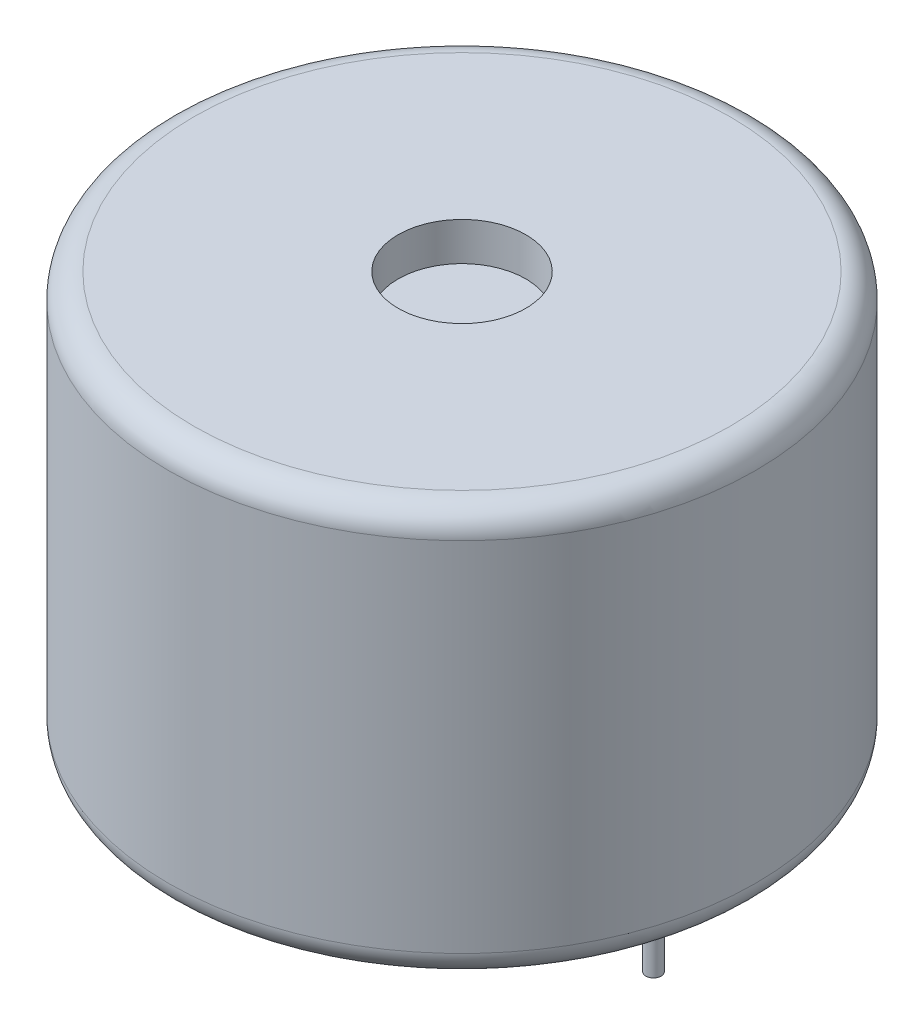
ISO-10303-21;
HEADER;
FILE_DESCRIPTION(('STEP AP214'),'2;1');
FILE_NAME('part.step','',(''),(''),'','','');
FILE_SCHEMA(('AUTOMOTIVE_DESIGN { 1 0 10303 214 1 1 1 1 }'));
ENDSEC;
DATA;
#1=APPLICATION_CONTEXT('core data for automotive mechanical design processes');
#2=APPLICATION_PROTOCOL_DEFINITION('international standard','automotive_design',2000,#1);
#3=PRODUCT_CONTEXT('',#1,'mechanical');
#4=PRODUCT('Part','Part','',(#3));
#5=PRODUCT_RELATED_PRODUCT_CATEGORY('part','',(#4));
#6=PRODUCT_DEFINITION_FORMATION('','',#4);
#7=PRODUCT_DEFINITION_CONTEXT('part definition',#1,'design');
#8=PRODUCT_DEFINITION('design','',#6,#7);
#9=PRODUCT_DEFINITION_SHAPE('','',#8);
#10=(LENGTH_UNIT() NAMED_UNIT(*) SI_UNIT(.MILLI.,.METRE.));
#11=(NAMED_UNIT(*) PLANE_ANGLE_UNIT() SI_UNIT($,.RADIAN.));
#12=(NAMED_UNIT(*) SI_UNIT($,.STERADIAN.) SOLID_ANGLE_UNIT());
#13=UNCERTAINTY_MEASURE_WITH_UNIT(LENGTH_MEASURE(1.E-05),#10,'distance_accuracy_value','');
#14=(GEOMETRIC_REPRESENTATION_CONTEXT(3) GLOBAL_UNCERTAINTY_ASSIGNED_CONTEXT((#13)) GLOBAL_UNIT_ASSIGNED_CONTEXT((#10,
#11,#12)) REPRESENTATION_CONTEXT('',''));
#15=CARTESIAN_POINT('',(0.,0.,0.));
#16=DIRECTION('',(0.,0.,1.));
#17=DIRECTION('',(1.,0.,0.));
#18=AXIS2_PLACEMENT_3D('',#15,#16,#17);
#19=CARTESIAN_POINT('',(0.,16.,0.));
#20=DIRECTION('',(0.,-1.,0.));
#21=DIRECTION('',(0.,0.,-1.));
#22=AXIS2_PLACEMENT_3D('',#19,#20,#21);
#23=CYLINDRICAL_SURFACE('',#22,11.5);
#24=CARTESIAN_POINT('',(0.,1.,0.));
#25=DIRECTION('',(0.,1.,0.));
#26=DIRECTION('',(0.,0.,1.));
#27=AXIS2_PLACEMENT_3D('',#24,#25,#26);
#28=CIRCLE('',#27,11.5);
#29=CARTESIAN_POINT('',(0.,1.,11.5));
#30=VERTEX_POINT('',#29);
#31=EDGE_CURVE('E48',#30,#30,#28,.T.);
#32=ORIENTED_EDGE('',*,*,#31,.T.);
#33=EDGE_LOOP('',(#32));
#34=FACE_BOUND('',#33,.T.);
#35=CARTESIAN_POINT('',(0.,15.,0.));
#36=DIRECTION('',(0.,1.,0.));
#37=DIRECTION('',(0.,0.,1.));
#38=AXIS2_PLACEMENT_3D('',#35,#36,#37);
#39=CIRCLE('',#38,11.5);
#40=CARTESIAN_POINT('',(0.,15.,11.5));
#41=VERTEX_POINT('',#40);
#42=EDGE_CURVE('E52',#41,#41,#39,.F.);
#43=ORIENTED_EDGE('',*,*,#42,.T.);
#44=EDGE_LOOP('',(#43));
#45=FACE_BOUND('',#44,.T.);
#46=ADVANCED_FACE('F37',(#34,#45),#23,.T.);
#47=CARTESIAN_POINT('',(0.,16.,0.));
#48=DIRECTION('',(0.,1.,0.));
#49=DIRECTION('',(0.,0.,1.));
#50=AXIS2_PLACEMENT_3D('',#47,#48,#49);
#51=PLANE('',#50);
#52=CARTESIAN_POINT('',(0.,16.,0.));
#53=DIRECTION('',(0.,1.,0.));
#54=DIRECTION('',(0.,0.,1.));
#55=AXIS2_PLACEMENT_3D('',#52,#53,#54);
#56=CIRCLE('',#55,10.5);
#57=CARTESIAN_POINT('',(0.,16.,10.5));
#58=VERTEX_POINT('',#57);
#59=EDGE_CURVE('E10',#58,#58,#56,.T.);
#60=ORIENTED_EDGE('',*,*,#59,.T.);
#61=EDGE_LOOP('',(#60));
#62=FACE_BOUND('',#61,.T.);
#63=CARTESIAN_POINT('',(0.,16.,0.));
#64=DIRECTION('',(0.,1.,0.));
#65=DIRECTION('',(-1.,0.,0.));
#66=AXIS2_PLACEMENT_3D('',#63,#64,#65);
#67=CIRCLE('',#66,2.5);
#68=CARTESIAN_POINT('',(-2.5,16.,0.));
#69=VERTEX_POINT('',#68);
#70=EDGE_CURVE('E69',#69,#69,#67,.T.);
#71=ORIENTED_EDGE('',*,*,#70,.F.);
#72=EDGE_LOOP('',(#71));
#73=FACE_BOUND('',#72,.T.);
#74=ADVANCED_FACE('F99',(#62,#73),#51,.T.);
#75=CARTESIAN_POINT('',(0.,0.,0.));
#76=DIRECTION('',(0.,1.,0.));
#77=DIRECTION('',(0.,0.,1.));
#78=AXIS2_PLACEMENT_3D('',#75,#76,#77);
#79=PLANE('',#78);
#80=CARTESIAN_POINT('',(0.,0.,0.));
#81=DIRECTION('',(0.,1.,0.));
#82=DIRECTION('',(0.,0.,1.));
#83=AXIS2_PLACEMENT_3D('',#80,#81,#82);
#84=CIRCLE('',#83,10.5);
#85=CARTESIAN_POINT('',(0.,0.,10.5));
#86=VERTEX_POINT('',#85);
#87=EDGE_CURVE('E44',#86,#86,#84,.F.);
#88=ORIENTED_EDGE('',*,*,#87,.T.);
#89=EDGE_LOOP('',(#88));
#90=FACE_BOUND('',#89,.T.);
#91=CARTESIAN_POINT('',(7.5,0.,0.));
#92=DIRECTION('',(0.,1.,0.));
#93=DIRECTION('',(0.,0.,1.));
#94=AXIS2_PLACEMENT_3D('',#91,#92,#93);
#95=CIRCLE('',#94,0.3);
#96=CARTESIAN_POINT('',(7.5,0.,0.3));
#97=VERTEX_POINT('',#96);
#98=EDGE_CURVE('E57',#97,#97,#95,.F.);
#99=ORIENTED_EDGE('',*,*,#98,.F.);
#100=EDGE_LOOP('',(#99));
#101=FACE_BOUND('',#100,.T.);
#102=CARTESIAN_POINT('',(-7.5,0.,0.));
#103=DIRECTION('',(0.,1.,0.));
#104=DIRECTION('',(0.,0.,1.));
#105=AXIS2_PLACEMENT_3D('',#102,#103,#104);
#106=CIRCLE('',#105,0.3);
#107=CARTESIAN_POINT('',(-7.5,0.,0.3));
#108=VERTEX_POINT('',#107);
#109=EDGE_CURVE('E60',#108,#108,#106,.F.);
#110=ORIENTED_EDGE('',*,*,#109,.F.);
#111=EDGE_LOOP('',(#110));
#112=FACE_BOUND('',#111,.T.);
#113=ADVANCED_FACE('F105',(#90,#101,#112),#79,.F.);
#114=CARTESIAN_POINT('',(-7.5,-4.,0.));
#115=DIRECTION('',(0.,1.,0.));
#116=DIRECTION('',(0.,0.,1.));
#117=AXIS2_PLACEMENT_3D('',#114,#115,#116);
#118=CYLINDRICAL_SURFACE('',#117,0.3);
#119=CARTESIAN_POINT('',(-7.5,-4.,0.));
#120=DIRECTION('',(0.,-1.,0.));
#121=DIRECTION('',(0.,0.,-1.));
#122=AXIS2_PLACEMENT_3D('',#119,#120,#121);
#123=CIRCLE('',#122,0.3);
#124=CARTESIAN_POINT('',(-7.5,-4.,-0.3));
#125=VERTEX_POINT('',#124);
#126=EDGE_CURVE('E63',#125,#125,#123,.T.);
#127=ORIENTED_EDGE('',*,*,#126,.F.);
#128=EDGE_LOOP('',(#127));
#129=FACE_BOUND('',#128,.T.);
#130=ORIENTED_EDGE('',*,*,#109,.T.);
#131=EDGE_LOOP('',(#130));
#132=FACE_BOUND('',#131,.T.);
#133=ADVANCED_FACE('F135',(#129,#132),#118,.T.);
#134=CARTESIAN_POINT('',(-7.5,-4.,0.));
#135=DIRECTION('',(0.,-1.,0.));
#136=DIRECTION('',(0.,0.,-1.));
#137=AXIS2_PLACEMENT_3D('',#134,#135,#136);
#138=PLANE('',#137);
#139=ORIENTED_EDGE('',*,*,#126,.T.);
#140=EDGE_LOOP('',(#139));
#141=FACE_BOUND('',#140,.T.);
#142=ADVANCED_FACE('F191',(#141),#138,.T.);
#143=CARTESIAN_POINT('',(7.5,-4.,0.));
#144=DIRECTION('',(0.,1.,0.));
#145=DIRECTION('',(0.,0.,1.));
#146=AXIS2_PLACEMENT_3D('',#143,#144,#145);
#147=CYLINDRICAL_SURFACE('',#146,0.3);
#148=CARTESIAN_POINT('',(7.5,-4.,0.));
#149=DIRECTION('',(0.,-1.,0.));
#150=DIRECTION('',(0.,0.,1.));
#151=AXIS2_PLACEMENT_3D('',#148,#149,#150);
#152=CIRCLE('',#151,0.3);
#153=CARTESIAN_POINT('',(7.5,-4.,0.3));
#154=VERTEX_POINT('',#153);
#155=EDGE_CURVE('E66',#154,#154,#152,.T.);
#156=ORIENTED_EDGE('',*,*,#155,.F.);
#157=EDGE_LOOP('',(#156));
#158=FACE_BOUND('',#157,.T.);
#159=ORIENTED_EDGE('',*,*,#98,.T.);
#160=EDGE_LOOP('',(#159));
#161=FACE_BOUND('',#160,.T.);
#162=ADVANCED_FACE('F181',(#158,#161),#147,.T.);
#163=CARTESIAN_POINT('',(7.5,-4.,0.));
#164=DIRECTION('',(0.,1.,0.));
#165=DIRECTION('',(0.,0.,1.));
#166=AXIS2_PLACEMENT_3D('',#163,#164,#165);
#167=PLANE('',#166);
#168=ORIENTED_EDGE('',*,*,#155,.T.);
#169=EDGE_LOOP('',(#168));
#170=FACE_BOUND('',#169,.T.);
#171=ADVANCED_FACE('F171',(#170),#167,.F.);
#172=CARTESIAN_POINT('',(0.,34.2402435780514,0.));
#173=DIRECTION('',(0.,1.,0.));
#174=DIRECTION('',(-1.,0.,0.));
#175=AXIS2_PLACEMENT_3D('',#172,#173,#174);
#176=CYLINDRICAL_SURFACE('',#175,2.5);
#177=ORIENTED_EDGE('',*,*,#70,.T.);
#178=EDGE_LOOP('',(#177));
#179=FACE_BOUND('',#178,.T.);
#180=CARTESIAN_POINT('',(0.,14.5,0.));
#181=DIRECTION('',(0.,1.,0.));
#182=DIRECTION('',(-1.,0.,0.));
#183=AXIS2_PLACEMENT_3D('',#180,#181,#182);
#184=CIRCLE('',#183,2.5);
#185=CARTESIAN_POINT('',(-2.5,14.5,0.));
#186=VERTEX_POINT('',#185);
#187=EDGE_CURVE('E72',#186,#186,#184,.T.);
#188=ORIENTED_EDGE('',*,*,#187,.F.);
#189=EDGE_LOOP('',(#188));
#190=FACE_BOUND('',#189,.T.);
#191=ADVANCED_FACE('F95',(#179,#190),#176,.F.);
#192=CARTESIAN_POINT('',(-2.5,14.5,0.));
#193=DIRECTION('',(0.,-1.,0.));
#194=DIRECTION('',(1.,0.,0.));
#195=AXIS2_PLACEMENT_3D('',#192,#193,#194);
#196=PLANE('',#195);
#197=ORIENTED_EDGE('',*,*,#187,.T.);
#198=EDGE_LOOP('',(#197));
#199=FACE_BOUND('',#198,.T.);
#200=CARTESIAN_POINT('',(0.,14.5,0.));
#201=DIRECTION('',(0.,1.,0.));
#202=DIRECTION('',(-1.,0.,0.));
#203=AXIS2_PLACEMENT_3D('',#200,#201,#202);
#204=CIRCLE('',#203,10.);
#205=CARTESIAN_POINT('',(-10.,14.5,0.));
#206=VERTEX_POINT('',#205);
#207=EDGE_CURVE('E75',#206,#206,#204,.T.);
#208=ORIENTED_EDGE('',*,*,#207,.F.);
#209=EDGE_LOOP('',(#208));
#210=FACE_BOUND('',#209,.T.);
#211=ADVANCED_FACE('F86',(#199,#210),#196,.T.);
#212=CARTESIAN_POINT('',(0.,34.2402435780514,0.));
#213=DIRECTION('',(0.,1.,0.));
#214=DIRECTION('',(-1.,0.,0.));
#215=AXIS2_PLACEMENT_3D('',#212,#213,#214);
#216=CYLINDRICAL_SURFACE('',#215,10.);
#217=ORIENTED_EDGE('',*,*,#207,.T.);
#218=EDGE_LOOP('',(#217));
#219=FACE_BOUND('',#218,.T.);
#220=CARTESIAN_POINT('',(0.,11.,0.));
#221=DIRECTION('',(0.,1.,0.));
#222=DIRECTION('',(-1.,0.,0.));
#223=AXIS2_PLACEMENT_3D('',#220,#221,#222);
#224=CIRCLE('',#223,10.);
#225=CARTESIAN_POINT('',(-10.,11.,0.));
#226=VERTEX_POINT('',#225);
#227=EDGE_CURVE('E78',#226,#226,#224,.T.);
#228=ORIENTED_EDGE('',*,*,#227,.F.);
#229=EDGE_LOOP('',(#228));
#230=FACE_BOUND('',#229,.T.);
#231=ADVANCED_FACE('F84',(#219,#230),#216,.F.);
#232=CARTESIAN_POINT('',(-10.,11.,0.));
#233=DIRECTION('',(0.,1.,0.));
#234=DIRECTION('',(-1.,0.,0.));
#235=AXIS2_PLACEMENT_3D('',#232,#233,#234);
#236=PLANE('',#235);
#237=ORIENTED_EDGE('',*,*,#227,.T.);
#238=EDGE_LOOP('',(#237));
#239=FACE_BOUND('',#238,.T.);
#240=ADVANCED_FACE('F82',(#239),#236,.T.);
#241=CARTESIAN_POINT('',(0.,1.,0.));
#242=DIRECTION('',(0.,1.,0.));
#243=DIRECTION('',(0.,0.,1.));
#244=AXIS2_PLACEMENT_3D('',#241,#242,#243);
#245=TOROIDAL_SURFACE('',#244,10.5,1.);
#246=ORIENTED_EDGE('',*,*,#87,.F.);
#247=EDGE_LOOP('',(#246));
#248=FACE_BOUND('',#247,.T.);
#249=ORIENTED_EDGE('',*,*,#31,.F.);
#250=EDGE_LOOP('',(#249));
#251=FACE_BOUND('',#250,.T.);
#252=ADVANCED_FACE('F93',(#248,#251),#245,.T.);
#253=CARTESIAN_POINT('',(0.,15.,0.));
#254=DIRECTION('',(0.,1.,0.));
#255=DIRECTION('',(0.,0.,1.));
#256=AXIS2_PLACEMENT_3D('',#253,#254,#255);
#257=TOROIDAL_SURFACE('',#256,10.5,1.);
#258=ORIENTED_EDGE('',*,*,#42,.F.);
#259=EDGE_LOOP('',(#258));
#260=FACE_BOUND('',#259,.T.);
#261=ORIENTED_EDGE('',*,*,#59,.F.);
#262=EDGE_LOOP('',(#261));
#263=FACE_BOUND('',#262,.T.);
#264=ADVANCED_FACE('F39',(#260,#263),#257,.T.);
#265=CLOSED_SHELL('',(#46,#74,#113,#133,#142,#162,#171,#191,#211,#231,#240,#252,#264));
#266=MANIFOLD_SOLID_BREP('B2',#265);
#267=ADVANCED_BREP_SHAPE_REPRESENTATION('',(#18,#266),#14);
#268=SHAPE_DEFINITION_REPRESENTATION(#9,#267);
ENDSEC;
END-ISO-10303-21;
